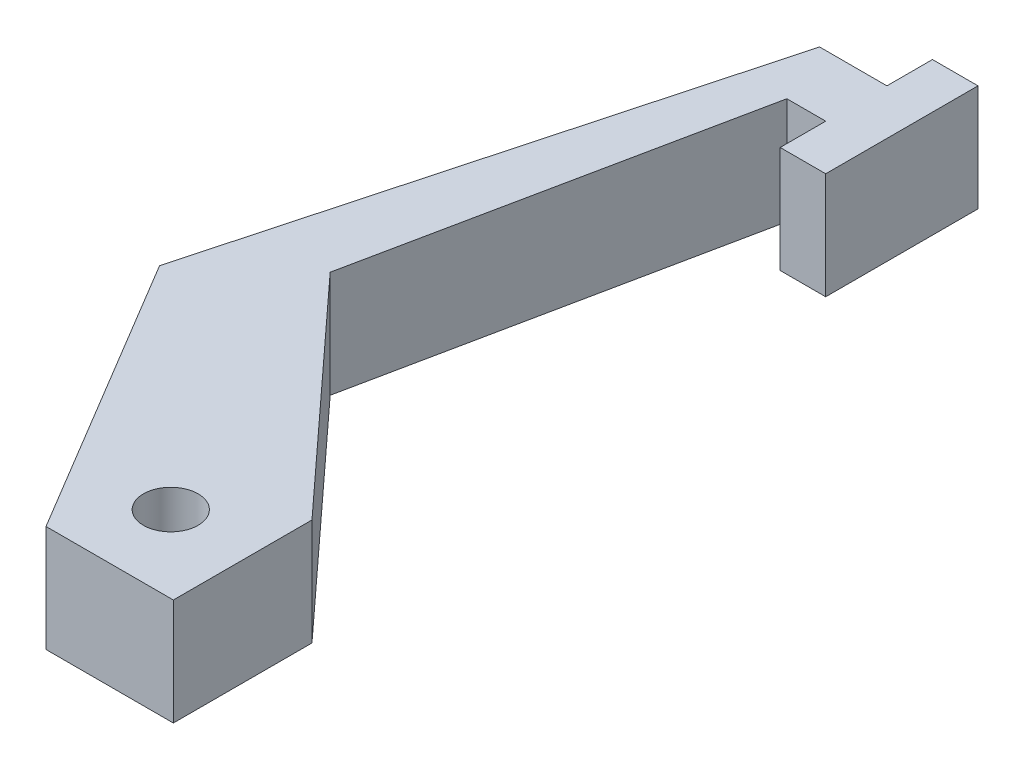
ISO-10303-21;
HEADER;
FILE_DESCRIPTION(('STEP AP214'),'2;1');
FILE_NAME('part.step','',(''),(''),'','','');
FILE_SCHEMA(('AUTOMOTIVE_DESIGN { 1 0 10303 214 1 1 1 1 }'));
ENDSEC;
DATA;
#1=APPLICATION_CONTEXT('core data for automotive mechanical design processes');
#2=APPLICATION_PROTOCOL_DEFINITION('international standard','automotive_design',2000,#1);
#3=PRODUCT_CONTEXT('',#1,'mechanical');
#4=PRODUCT('Part','Part','',(#3));
#5=PRODUCT_RELATED_PRODUCT_CATEGORY('part','',(#4));
#6=PRODUCT_DEFINITION_FORMATION('','',#4);
#7=PRODUCT_DEFINITION_CONTEXT('part definition',#1,'design');
#8=PRODUCT_DEFINITION('design','',#6,#7);
#9=PRODUCT_DEFINITION_SHAPE('','',#8);
#10=(LENGTH_UNIT() NAMED_UNIT(*) SI_UNIT(.MILLI.,.METRE.));
#11=(NAMED_UNIT(*) PLANE_ANGLE_UNIT() SI_UNIT($,.RADIAN.));
#12=(NAMED_UNIT(*) SI_UNIT($,.STERADIAN.) SOLID_ANGLE_UNIT());
#13=UNCERTAINTY_MEASURE_WITH_UNIT(LENGTH_MEASURE(1.E-05),#10,'distance_accuracy_value','');
#14=(GEOMETRIC_REPRESENTATION_CONTEXT(3) GLOBAL_UNCERTAINTY_ASSIGNED_CONTEXT((#13)) GLOBAL_UNIT_ASSIGNED_CONTEXT((#10,
#11,#12)) REPRESENTATION_CONTEXT('',''));
#15=CARTESIAN_POINT('',(0.,0.,0.));
#16=DIRECTION('',(0.,0.,1.));
#17=DIRECTION('',(1.,0.,0.));
#18=AXIS2_PLACEMENT_3D('',#15,#16,#17);
#19=CARTESIAN_POINT('',(0.,11.7,0.));
#20=DIRECTION('',(0.,-1.,0.));
#21=DIRECTION('',(0.,0.,-1.));
#22=AXIS2_PLACEMENT_3D('',#19,#20,#21);
#23=PLANE('',#22);
#24=DIRECTION('',(0.,0.,-1.));
#25=VECTOR('',#24,1.);
#26=CARTESIAN_POINT('',(0.,11.7,0.));
#27=LINE('',#26,#25);
#28=CARTESIAN_POINT('',(0.,11.7,0.));
#29=VERTEX_POINT('',#28);
#30=CARTESIAN_POINT('',(0.,11.7,-15.2188626907074));
#31=VERTEX_POINT('',#30);
#32=EDGE_CURVE('E185',#29,#31,#27,.T.);
#33=ORIENTED_EDGE('',*,*,#32,.T.);
#34=DIRECTION('',(-0.676493134480003,0.,-0.736448938488895));
#35=VECTOR('',#34,1.);
#36=CARTESIAN_POINT('',(0.,11.7,-15.2188626907074));
#37=LINE('',#36,#35);
#38=CARTESIAN_POINT('',(-22.5541808535769,11.7,-39.7719611650486));
#39=VERTEX_POINT('',#38);
#40=EDGE_CURVE('E108',#31,#39,#37,.T.);
#41=ORIENTED_EDGE('',*,*,#40,.T.);
#42=DIRECTION('',(0.20201850687536,0.,-0.979381704382847));
#43=VECTOR('',#42,1.);
#44=CARTESIAN_POINT('',(-22.5541808535769,11.7,-39.7719611650486));
#45=LINE('',#44,#43);
#46=CARTESIAN_POINT('',(-13.980822987213,11.7,-81.3354296279851));
#47=VERTEX_POINT('',#46);
#48=EDGE_CURVE('E215',#39,#47,#45,.T.);
#49=ORIENTED_EDGE('',*,*,#48,.T.);
#50=DIRECTION('',(1.,0.,0.));
#51=VECTOR('',#50,1.);
#52=CARTESIAN_POINT('',(-13.980822987213,11.7,-81.3354296279851));
#53=LINE('',#52,#51);
#54=CARTESIAN_POINT('',(-9.71505089993741,11.7,-81.3354296279851));
#55=VERTEX_POINT('',#54);
#56=EDGE_CURVE('E234',#47,#55,#53,.T.);
#57=ORIENTED_EDGE('',*,*,#56,.T.);
#58=DIRECTION('',(0.,0.,1.));
#59=VECTOR('',#58,1.);
#60=CARTESIAN_POINT('',(-9.71505089993741,11.7,-81.3354296279851));
#61=LINE('',#60,#59);
#62=CARTESIAN_POINT('',(-9.71505089993741,11.7,-76.3354296279851));
#63=VERTEX_POINT('',#62);
#64=EDGE_CURVE('E231',#55,#63,#61,.T.);
#65=ORIENTED_EDGE('',*,*,#64,.T.);
#66=DIRECTION('',(1.,0.,0.));
#67=VECTOR('',#66,1.);
#68=CARTESIAN_POINT('',(-9.71505089993741,11.7,-76.3354296279851));
#69=LINE('',#68,#67);
#70=CARTESIAN_POINT('',(-4.71505089993742,11.7,-76.3354296279851));
#71=VERTEX_POINT('',#70);
#72=EDGE_CURVE('E233',#63,#71,#69,.T.);
#73=ORIENTED_EDGE('',*,*,#72,.T.);
#74=DIRECTION('',(0.,0.,-1.));
#75=VECTOR('',#74,1.);
#76=CARTESIAN_POINT('',(-4.71505089993742,11.7,-76.3354296279851));
#77=LINE('',#76,#75);
#78=CARTESIAN_POINT('',(-4.71505089993742,11.7,-93.0551428007433));
#79=VERTEX_POINT('',#78);
#80=EDGE_CURVE('E236',#71,#79,#77,.T.);
#81=ORIENTED_EDGE('',*,*,#80,.T.);
#82=DIRECTION('',(-1.,0.,0.));
#83=VECTOR('',#82,1.);
#84=CARTESIAN_POINT('',(-4.71505089993742,11.7,-93.0551428007433));
#85=LINE('',#84,#83);
#86=CARTESIAN_POINT('',(-9.71505089993742,11.7,-93.0551428007433));
#87=VERTEX_POINT('',#86);
#88=EDGE_CURVE('E242',#79,#87,#85,.T.);
#89=ORIENTED_EDGE('',*,*,#88,.T.);
#90=DIRECTION('',(0.,0.,1.));
#91=VECTOR('',#90,1.);
#92=CARTESIAN_POINT('',(-9.71505089993742,11.7,-93.0551428007433));
#93=LINE('',#92,#91);
#94=CARTESIAN_POINT('',(-9.71505089993742,11.7,-88.0551428007433));
#95=VERTEX_POINT('',#94);
#96=EDGE_CURVE('E244',#87,#95,#93,.T.);
#97=ORIENTED_EDGE('',*,*,#96,.T.);
#98=DIRECTION('',(-1.,0.,0.));
#99=VECTOR('',#98,1.);
#100=CARTESIAN_POINT('',(-9.71505089993742,11.7,-88.0551428007433));
#101=LINE('',#100,#99);
#102=CARTESIAN_POINT('',(-17.1057647675567,11.7,-88.0551428007433));
#103=VERTEX_POINT('',#102);
#104=EDGE_CURVE('E142',#95,#103,#101,.T.);
#105=ORIENTED_EDGE('',*,*,#104,.T.);
#106=DIRECTION('',(-0.261296140558108,0.,0.96525868394407));
#107=VECTOR('',#106,1.);
#108=CARTESIAN_POINT('',(-17.1057647675567,11.7,-88.0551428007433));
#109=LINE('',#108,#107);
#110=CARTESIAN_POINT('',(-32.5429436779472,11.7,-31.0283877670656));
#111=VERTEX_POINT('',#110);
#112=EDGE_CURVE('E136',#103,#111,#109,.T.);
#113=ORIENTED_EDGE('',*,*,#112,.T.);
#114=DIRECTION('',(0.513378614574455,0.,0.858162221318099));
#115=VECTOR('',#114,1.);
#116=CARTESIAN_POINT('',(-32.5429436779472,11.7,-31.0283877670656));
#117=LINE('',#116,#115);
#118=CARTESIAN_POINT('',(-13.980822987213,11.7,0.));
#119=VERTEX_POINT('',#118);
#120=EDGE_CURVE('E140',#111,#119,#117,.T.);
#121=ORIENTED_EDGE('',*,*,#120,.T.);
#122=DIRECTION('',(1.,0.,0.));
#123=VECTOR('',#122,1.);
#124=CARTESIAN_POINT('',(0.,11.7,0.));
#125=LINE('',#124,#123);
#126=EDGE_CURVE('E50',#119,#29,#125,.T.);
#127=ORIENTED_EDGE('',*,*,#126,.T.);
#128=EDGE_LOOP('',(#33,#41,#49,#57,#65,#73,#81,#89,#97,#105,#113,#121,#127));
#129=FACE_BOUND('',#128,.T.);
#130=CARTESIAN_POINT('',(-8.73675450762829,11.7,-8.45492371705964));
#131=DIRECTION('',(0.,1.,0.));
#132=DIRECTION('',(0.,0.,1.));
#133=AXIS2_PLACEMENT_3D('',#130,#131,#132);
#134=CIRCLE('',#133,3.);
#135=CARTESIAN_POINT('',(-8.73675450762829,11.7,-5.45492371705964));
#136=VERTEX_POINT('',#135);
#137=EDGE_CURVE('E164',#136,#136,#134,.T.);
#138=ORIENTED_EDGE('',*,*,#137,.F.);
#139=EDGE_LOOP('',(#138));
#140=FACE_BOUND('',#139,.T.);
#141=ADVANCED_FACE('F33',(#129,#140),#23,.F.);
#142=CARTESIAN_POINT('',(0.,0.,0.));
#143=DIRECTION('',(0.,-1.,0.));
#144=DIRECTION('',(0.,0.,-1.));
#145=AXIS2_PLACEMENT_3D('',#142,#143,#144);
#146=PLANE('',#145);
#147=DIRECTION('',(0.,0.,-1.));
#148=VECTOR('',#147,1.);
#149=CARTESIAN_POINT('',(0.,0.,0.));
#150=LINE('',#149,#148);
#151=CARTESIAN_POINT('',(0.,0.,0.));
#152=VERTEX_POINT('',#151);
#153=CARTESIAN_POINT('',(0.,0.,-15.2188626907074));
#154=VERTEX_POINT('',#153);
#155=EDGE_CURVE('E160',#152,#154,#150,.T.);
#156=ORIENTED_EDGE('',*,*,#155,.F.);
#157=DIRECTION('',(1.,0.,0.));
#158=VECTOR('',#157,1.);
#159=CARTESIAN_POINT('',(0.,0.,0.));
#160=LINE('',#159,#158);
#161=CARTESIAN_POINT('',(-13.980822987213,0.,0.));
#162=VERTEX_POINT('',#161);
#163=EDGE_CURVE('E100',#162,#152,#160,.T.);
#164=ORIENTED_EDGE('',*,*,#163,.F.);
#165=DIRECTION('',(0.513378614574455,0.,0.858162221318099));
#166=VECTOR('',#165,1.);
#167=CARTESIAN_POINT('',(-32.5429436779472,0.,-31.0283877670656));
#168=LINE('',#167,#166);
#169=CARTESIAN_POINT('',(-32.5429436779472,0.,-31.0283877670656));
#170=VERTEX_POINT('',#169);
#171=EDGE_CURVE('E94',#170,#162,#168,.T.);
#172=ORIENTED_EDGE('',*,*,#171,.F.);
#173=DIRECTION('',(-0.261296140558108,0.,0.96525868394407));
#174=VECTOR('',#173,1.);
#175=CARTESIAN_POINT('',(-17.1057647675567,0.,-88.0551428007433));
#176=LINE('',#175,#174);
#177=CARTESIAN_POINT('',(-17.1057647675567,0.,-88.0551428007433));
#178=VERTEX_POINT('',#177);
#179=EDGE_CURVE('E150',#178,#170,#176,.T.);
#180=ORIENTED_EDGE('',*,*,#179,.F.);
#181=DIRECTION('',(-1.,0.,0.));
#182=VECTOR('',#181,1.);
#183=CARTESIAN_POINT('',(-9.71505089993742,0.,-88.0551428007433));
#184=LINE('',#183,#182);
#185=CARTESIAN_POINT('',(-9.71505089993742,0.,-88.0551428007433));
#186=VERTEX_POINT('',#185);
#187=EDGE_CURVE('E180',#186,#178,#184,.T.);
#188=ORIENTED_EDGE('',*,*,#187,.F.);
#189=DIRECTION('',(0.,0.,1.));
#190=VECTOR('',#189,1.);
#191=CARTESIAN_POINT('',(-9.71505089993742,0.,-93.0551428007433));
#192=LINE('',#191,#190);
#193=CARTESIAN_POINT('',(-9.71505089993742,0.,-93.0551428007433));
#194=VERTEX_POINT('',#193);
#195=EDGE_CURVE('E178',#194,#186,#192,.T.);
#196=ORIENTED_EDGE('',*,*,#195,.F.);
#197=DIRECTION('',(-1.,0.,0.));
#198=VECTOR('',#197,1.);
#199=CARTESIAN_POINT('',(-4.71505089993742,0.,-93.0551428007433));
#200=LINE('',#199,#198);
#201=CARTESIAN_POINT('',(-4.71505089993742,0.,-93.0551428007433));
#202=VERTEX_POINT('',#201);
#203=EDGE_CURVE('E176',#202,#194,#200,.T.);
#204=ORIENTED_EDGE('',*,*,#203,.F.);
#205=DIRECTION('',(0.,0.,-1.));
#206=VECTOR('',#205,1.);
#207=CARTESIAN_POINT('',(-4.71505089993742,0.,-76.3354296279851));
#208=LINE('',#207,#206);
#209=CARTESIAN_POINT('',(-4.71505089993742,0.,-76.3354296279851));
#210=VERTEX_POINT('',#209);
#211=EDGE_CURVE('E174',#210,#202,#208,.T.);
#212=ORIENTED_EDGE('',*,*,#211,.F.);
#213=DIRECTION('',(1.,0.,0.));
#214=VECTOR('',#213,1.);
#215=CARTESIAN_POINT('',(-9.71505089993741,0.,-76.3354296279851));
#216=LINE('',#215,#214);
#217=CARTESIAN_POINT('',(-9.71505089993741,0.,-76.3354296279851));
#218=VERTEX_POINT('',#217);
#219=EDGE_CURVE('E172',#218,#210,#216,.T.);
#220=ORIENTED_EDGE('',*,*,#219,.F.);
#221=DIRECTION('',(0.,0.,1.));
#222=VECTOR('',#221,1.);
#223=CARTESIAN_POINT('',(-9.71505089993741,0.,-81.3354296279851));
#224=LINE('',#223,#222);
#225=CARTESIAN_POINT('',(-9.71505089993741,0.,-81.3354296279851));
#226=VERTEX_POINT('',#225);
#227=EDGE_CURVE('E170',#226,#218,#224,.T.);
#228=ORIENTED_EDGE('',*,*,#227,.F.);
#229=DIRECTION('',(1.,0.,0.));
#230=VECTOR('',#229,1.);
#231=CARTESIAN_POINT('',(-13.980822987213,0.,-81.3354296279851));
#232=LINE('',#231,#230);
#233=CARTESIAN_POINT('',(-13.980822987213,0.,-81.3354296279851));
#234=VERTEX_POINT('',#233);
#235=EDGE_CURVE('E168',#234,#226,#232,.T.);
#236=ORIENTED_EDGE('',*,*,#235,.F.);
#237=DIRECTION('',(0.20201850687536,0.,-0.979381704382847));
#238=VECTOR('',#237,1.);
#239=CARTESIAN_POINT('',(-22.5541808535769,0.,-39.7719611650486));
#240=LINE('',#239,#238);
#241=CARTESIAN_POINT('',(-22.5541808535769,0.,-39.7719611650486));
#242=VERTEX_POINT('',#241);
#243=EDGE_CURVE('E166',#242,#234,#240,.T.);
#244=ORIENTED_EDGE('',*,*,#243,.F.);
#245=DIRECTION('',(-0.676493134480003,0.,-0.736448938488895));
#246=VECTOR('',#245,1.);
#247=CARTESIAN_POINT('',(0.,0.,-15.2188626907074));
#248=LINE('',#247,#246);
#249=EDGE_CURVE('E163',#154,#242,#248,.T.);
#250=ORIENTED_EDGE('',*,*,#249,.F.);
#251=EDGE_LOOP('',(#156,#164,#172,#180,#188,#196,#204,#212,#220,#228,#236,#244,#250));
#252=FACE_BOUND('',#251,.T.);
#253=CARTESIAN_POINT('',(-8.73675450762829,0.,-8.45492371705964));
#254=DIRECTION('',(0.,1.,0.));
#255=DIRECTION('',(0.,0.,1.));
#256=AXIS2_PLACEMENT_3D('',#253,#254,#255);
#257=CIRCLE('',#256,3.);
#258=CARTESIAN_POINT('',(-8.73675450762829,0.,-5.45492371705964));
#259=VERTEX_POINT('',#258);
#260=EDGE_CURVE('E410',#259,#259,#257,.T.);
#261=ORIENTED_EDGE('',*,*,#260,.T.);
#262=EDGE_LOOP('',(#261));
#263=FACE_BOUND('',#262,.T.);
#264=ADVANCED_FACE('F219',(#252,#263),#146,.T.);
#265=CARTESIAN_POINT('',(0.,11.7,0.));
#266=DIRECTION('',(-1.,0.,0.));
#267=DIRECTION('',(0.,0.,1.));
#268=AXIS2_PLACEMENT_3D('',#265,#266,#267);
#269=PLANE('',#268);
#270=ORIENTED_EDGE('',*,*,#155,.T.);
#271=DIRECTION('',(0.,-1.,0.));
#272=VECTOR('',#271,1.);
#273=CARTESIAN_POINT('',(0.,11.7,-15.2188626907074));
#274=LINE('',#273,#272);
#275=EDGE_CURVE('E11',#31,#154,#274,.T.);
#276=ORIENTED_EDGE('',*,*,#275,.F.);
#277=ORIENTED_EDGE('',*,*,#32,.F.);
#278=DIRECTION('',(0.,-1.,0.));
#279=VECTOR('',#278,1.);
#280=CARTESIAN_POINT('',(0.,11.7,0.));
#281=LINE('',#280,#279);
#282=EDGE_CURVE('E156',#29,#152,#281,.T.);
#283=ORIENTED_EDGE('',*,*,#282,.T.);
#284=EDGE_LOOP('',(#270,#276,#277,#283));
#285=FACE_BOUND('',#284,.T.);
#286=ADVANCED_FACE('F35',(#285),#269,.F.);
#287=CARTESIAN_POINT('',(0.,11.7,-15.2188626907074));
#288=DIRECTION('',(-0.736448938488895,0.,0.676493134480003));
#289=DIRECTION('',(0.676493134480003,0.,0.736448938488895));
#290=AXIS2_PLACEMENT_3D('',#287,#288,#289);
#291=PLANE('',#290);
#292=ORIENTED_EDGE('',*,*,#249,.T.);
#293=DIRECTION('',(0.,-1.,0.));
#294=VECTOR('',#293,1.);
#295=CARTESIAN_POINT('',(-22.5541808535769,11.7,-39.7719611650486));
#296=LINE('',#295,#294);
#297=EDGE_CURVE('E42',#39,#242,#296,.T.);
#298=ORIENTED_EDGE('',*,*,#297,.F.);
#299=ORIENTED_EDGE('',*,*,#40,.F.);
#300=ORIENTED_EDGE('',*,*,#275,.T.);
#301=EDGE_LOOP('',(#292,#298,#299,#300));
#302=FACE_BOUND('',#301,.T.);
#303=ADVANCED_FACE('F278',(#302),#291,.F.);
#304=CARTESIAN_POINT('',(-22.5541808535769,11.7,-39.7719611650486));
#305=DIRECTION('',(-0.979381704382847,0.,-0.20201850687536));
#306=DIRECTION('',(-0.20201850687536,0.,0.979381704382847));
#307=AXIS2_PLACEMENT_3D('',#304,#305,#306);
#308=PLANE('',#307);
#309=ORIENTED_EDGE('',*,*,#243,.T.);
#310=DIRECTION('',(0.,-1.,0.));
#311=VECTOR('',#310,1.);
#312=CARTESIAN_POINT('',(-13.980822987213,11.7,-81.3354296279851));
#313=LINE('',#312,#311);
#314=EDGE_CURVE('E207',#47,#234,#313,.T.);
#315=ORIENTED_EDGE('',*,*,#314,.F.);
#316=ORIENTED_EDGE('',*,*,#48,.F.);
#317=ORIENTED_EDGE('',*,*,#297,.T.);
#318=EDGE_LOOP('',(#309,#315,#316,#317));
#319=FACE_BOUND('',#318,.T.);
#320=ADVANCED_FACE('F213',(#319),#308,.F.);
#321=CARTESIAN_POINT('',(-13.980822987213,11.7,-81.3354296279851));
#322=DIRECTION('',(0.,0.,-1.));
#323=DIRECTION('',(-1.,0.,0.));
#324=AXIS2_PLACEMENT_3D('',#321,#322,#323);
#325=PLANE('',#324);
#326=ORIENTED_EDGE('',*,*,#235,.T.);
#327=DIRECTION('',(0.,-1.,0.));
#328=VECTOR('',#327,1.);
#329=CARTESIAN_POINT('',(-9.71505089993741,11.7,-81.3354296279851));
#330=LINE('',#329,#328);
#331=EDGE_CURVE('E204',#55,#226,#330,.T.);
#332=ORIENTED_EDGE('',*,*,#331,.F.);
#333=ORIENTED_EDGE('',*,*,#56,.F.);
#334=ORIENTED_EDGE('',*,*,#314,.T.);
#335=EDGE_LOOP('',(#326,#332,#333,#334));
#336=FACE_BOUND('',#335,.T.);
#337=ADVANCED_FACE('F225',(#336),#325,.F.);
#338=CARTESIAN_POINT('',(-9.71505089993741,11.7,-81.3354296279851));
#339=DIRECTION('',(1.,0.,0.));
#340=DIRECTION('',(0.,0.,-1.));
#341=AXIS2_PLACEMENT_3D('',#338,#339,#340);
#342=PLANE('',#341);
#343=ORIENTED_EDGE('',*,*,#227,.T.);
#344=DIRECTION('',(0.,-1.,0.));
#345=VECTOR('',#344,1.);
#346=CARTESIAN_POINT('',(-9.71505089993741,11.7,-76.3354296279851));
#347=LINE('',#346,#345);
#348=EDGE_CURVE('E201',#63,#218,#347,.T.);
#349=ORIENTED_EDGE('',*,*,#348,.F.);
#350=ORIENTED_EDGE('',*,*,#64,.F.);
#351=ORIENTED_EDGE('',*,*,#331,.T.);
#352=EDGE_LOOP('',(#343,#349,#350,#351));
#353=FACE_BOUND('',#352,.T.);
#354=ADVANCED_FACE('F229',(#353),#342,.F.);
#355=CARTESIAN_POINT('',(-9.71505089993741,11.7,-76.3354296279851));
#356=DIRECTION('',(0.,0.,-1.));
#357=DIRECTION('',(-1.,0.,0.));
#358=AXIS2_PLACEMENT_3D('',#355,#356,#357);
#359=PLANE('',#358);
#360=ORIENTED_EDGE('',*,*,#219,.T.);
#361=DIRECTION('',(0.,-1.,0.));
#362=VECTOR('',#361,1.);
#363=CARTESIAN_POINT('',(-4.71505089993742,11.7,-76.3354296279851));
#364=LINE('',#363,#362);
#365=EDGE_CURVE('E198',#71,#210,#364,.T.);
#366=ORIENTED_EDGE('',*,*,#365,.F.);
#367=ORIENTED_EDGE('',*,*,#72,.F.);
#368=ORIENTED_EDGE('',*,*,#348,.T.);
#369=EDGE_LOOP('',(#360,#366,#367,#368));
#370=FACE_BOUND('',#369,.T.);
#371=ADVANCED_FACE('F291',(#370),#359,.F.);
#372=CARTESIAN_POINT('',(-4.71505089993742,11.7,-76.3354296279851));
#373=DIRECTION('',(-1.,0.,0.));
#374=DIRECTION('',(0.,0.,1.));
#375=AXIS2_PLACEMENT_3D('',#372,#373,#374);
#376=PLANE('',#375);
#377=ORIENTED_EDGE('',*,*,#211,.T.);
#378=DIRECTION('',(0.,-1.,0.));
#379=VECTOR('',#378,1.);
#380=CARTESIAN_POINT('',(-4.71505089993742,11.7,-93.0551428007433));
#381=LINE('',#380,#379);
#382=EDGE_CURVE('E195',#79,#202,#381,.T.);
#383=ORIENTED_EDGE('',*,*,#382,.F.);
#384=ORIENTED_EDGE('',*,*,#80,.F.);
#385=ORIENTED_EDGE('',*,*,#365,.T.);
#386=EDGE_LOOP('',(#377,#383,#384,#385));
#387=FACE_BOUND('',#386,.T.);
#388=ADVANCED_FACE('F294',(#387),#376,.F.);
#389=CARTESIAN_POINT('',(-4.71505089993742,11.7,-93.0551428007433));
#390=DIRECTION('',(0.,0.,1.));
#391=DIRECTION('',(1.,0.,0.));
#392=AXIS2_PLACEMENT_3D('',#389,#390,#391);
#393=PLANE('',#392);
#394=ORIENTED_EDGE('',*,*,#203,.T.);
#395=DIRECTION('',(0.,-1.,0.));
#396=VECTOR('',#395,1.);
#397=CARTESIAN_POINT('',(-9.71505089993742,11.7,-93.0551428007433));
#398=LINE('',#397,#396);
#399=EDGE_CURVE('E192',#87,#194,#398,.T.);
#400=ORIENTED_EDGE('',*,*,#399,.F.);
#401=ORIENTED_EDGE('',*,*,#88,.F.);
#402=ORIENTED_EDGE('',*,*,#382,.T.);
#403=EDGE_LOOP('',(#394,#400,#401,#402));
#404=FACE_BOUND('',#403,.T.);
#405=ADVANCED_FACE('F298',(#404),#393,.F.);
#406=CARTESIAN_POINT('',(-9.71505089993742,11.7,-93.0551428007433));
#407=DIRECTION('',(1.,0.,0.));
#408=DIRECTION('',(0.,0.,-1.));
#409=AXIS2_PLACEMENT_3D('',#406,#407,#408);
#410=PLANE('',#409);
#411=ORIENTED_EDGE('',*,*,#195,.T.);
#412=DIRECTION('',(0.,-1.,0.));
#413=VECTOR('',#412,1.);
#414=CARTESIAN_POINT('',(-9.71505089993742,11.7,-88.0551428007433));
#415=LINE('',#414,#413);
#416=EDGE_CURVE('E189',#95,#186,#415,.T.);
#417=ORIENTED_EDGE('',*,*,#416,.F.);
#418=ORIENTED_EDGE('',*,*,#96,.F.);
#419=ORIENTED_EDGE('',*,*,#399,.T.);
#420=EDGE_LOOP('',(#411,#417,#418,#419));
#421=FACE_BOUND('',#420,.T.);
#422=ADVANCED_FACE('F250',(#421),#410,.F.);
#423=CARTESIAN_POINT('',(-9.71505089993742,11.7,-88.0551428007433));
#424=DIRECTION('',(0.,0.,1.));
#425=DIRECTION('',(1.,0.,0.));
#426=AXIS2_PLACEMENT_3D('',#423,#424,#425);
#427=PLANE('',#426);
#428=ORIENTED_EDGE('',*,*,#187,.T.);
#429=DIRECTION('',(0.,-1.,0.));
#430=VECTOR('',#429,1.);
#431=CARTESIAN_POINT('',(-17.1057647675567,11.7,-88.0551428007433));
#432=LINE('',#431,#430);
#433=EDGE_CURVE('E151',#103,#178,#432,.T.);
#434=ORIENTED_EDGE('',*,*,#433,.F.);
#435=ORIENTED_EDGE('',*,*,#104,.F.);
#436=ORIENTED_EDGE('',*,*,#416,.T.);
#437=EDGE_LOOP('',(#428,#434,#435,#436));
#438=FACE_BOUND('',#437,.T.);
#439=ADVANCED_FACE('F254',(#438),#427,.F.);
#440=CARTESIAN_POINT('',(-17.1057647675567,11.7,-88.0551428007433));
#441=DIRECTION('',(0.96525868394407,0.,0.261296140558108));
#442=DIRECTION('',(0.261296140558108,0.,-0.96525868394407));
#443=AXIS2_PLACEMENT_3D('',#440,#441,#442);
#444=PLANE('',#443);
#445=ORIENTED_EDGE('',*,*,#179,.T.);
#446=DIRECTION('',(0.,-1.,0.));
#447=VECTOR('',#446,1.);
#448=CARTESIAN_POINT('',(-32.5429436779472,11.7,-31.0283877670656));
#449=LINE('',#448,#447);
#450=EDGE_CURVE('E147',#111,#170,#449,.T.);
#451=ORIENTED_EDGE('',*,*,#450,.F.);
#452=ORIENTED_EDGE('',*,*,#112,.F.);
#453=ORIENTED_EDGE('',*,*,#433,.T.);
#454=EDGE_LOOP('',(#445,#451,#452,#453));
#455=FACE_BOUND('',#454,.T.);
#456=ADVANCED_FACE('F148',(#455),#444,.F.);
#457=CARTESIAN_POINT('',(-32.5429436779472,11.7,-31.0283877670656));
#458=DIRECTION('',(0.858162221318098,0.,-0.513378614574455));
#459=DIRECTION('',(-0.513378614574455,0.,-0.858162221318099));
#460=AXIS2_PLACEMENT_3D('',#457,#458,#459);
#461=PLANE('',#460);
#462=ORIENTED_EDGE('',*,*,#171,.T.);
#463=DIRECTION('',(0.,-1.,0.));
#464=VECTOR('',#463,1.);
#465=CARTESIAN_POINT('',(-13.980822987213,11.7,0.));
#466=LINE('',#465,#464);
#467=EDGE_CURVE('E152',#119,#162,#466,.T.);
#468=ORIENTED_EDGE('',*,*,#467,.F.);
#469=ORIENTED_EDGE('',*,*,#120,.F.);
#470=ORIENTED_EDGE('',*,*,#450,.T.);
#471=EDGE_LOOP('',(#462,#468,#469,#470));
#472=FACE_BOUND('',#471,.T.);
#473=ADVANCED_FACE('F154',(#472),#461,.F.);
#474=CARTESIAN_POINT('',(0.,11.7,0.));
#475=DIRECTION('',(0.,0.,-1.));
#476=DIRECTION('',(-1.,0.,0.));
#477=AXIS2_PLACEMENT_3D('',#474,#475,#476);
#478=PLANE('',#477);
#479=ORIENTED_EDGE('',*,*,#163,.T.);
#480=ORIENTED_EDGE('',*,*,#282,.F.);
#481=ORIENTED_EDGE('',*,*,#126,.F.);
#482=ORIENTED_EDGE('',*,*,#467,.T.);
#483=EDGE_LOOP('',(#479,#480,#481,#482));
#484=FACE_BOUND('',#483,.T.);
#485=ADVANCED_FACE('F258',(#484),#478,.F.);
#486=CARTESIAN_POINT('',(-8.73675450762829,11.7,-8.45492371705964));
#487=DIRECTION('',(0.,-1.,0.));
#488=DIRECTION('',(0.,0.,-1.));
#489=AXIS2_PLACEMENT_3D('',#486,#487,#488);
#490=CYLINDRICAL_SURFACE('',#489,3.);
#491=ORIENTED_EDGE('',*,*,#137,.T.);
#492=EDGE_LOOP('',(#491));
#493=FACE_BOUND('',#492,.T.);
#494=ORIENTED_EDGE('',*,*,#260,.F.);
#495=EDGE_LOOP('',(#494));
#496=FACE_BOUND('',#495,.T.);
#497=ADVANCED_FACE('F260',(#493,#496),#490,.F.);
#498=CLOSED_SHELL('',(#141,#264,#286,#303,#320,#337,#354,#371,#388,#405,#422,#439,#456,#473,
#485,#497));
#499=MANIFOLD_SOLID_BREP('B2',#498);
#500=ADVANCED_BREP_SHAPE_REPRESENTATION('',(#18,#499),#14);
#501=SHAPE_DEFINITION_REPRESENTATION(#9,#500);
ENDSEC;
END-ISO-10303-21;
